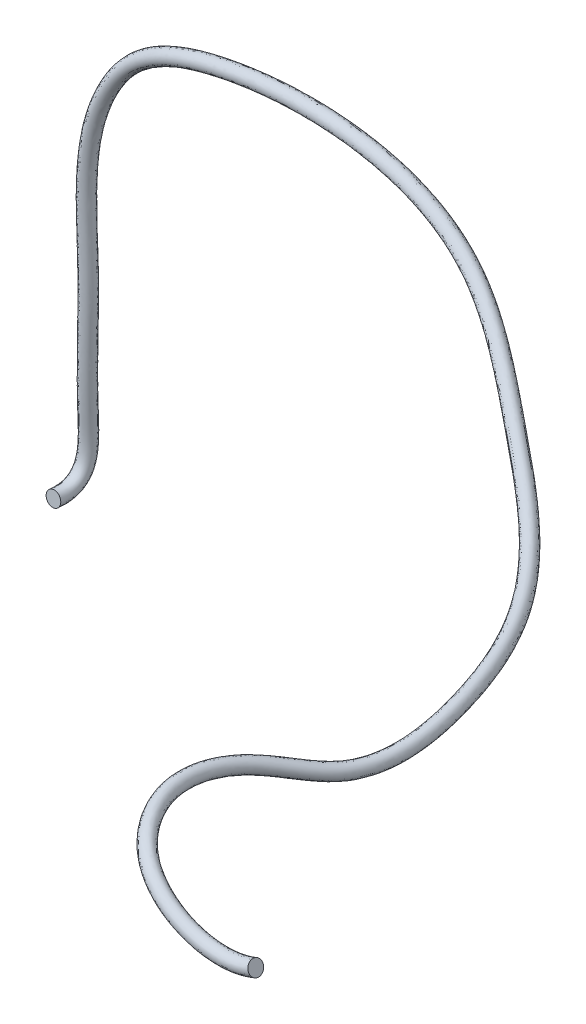
ISO-10303-21;
HEADER;
FILE_DESCRIPTION(('STEP AP214'),'2;1');
FILE_NAME('part.step','',(''),(''),'','','');
FILE_SCHEMA(('AUTOMOTIVE_DESIGN { 1 0 10303 214 1 1 1 1 }'));
ENDSEC;
DATA;
#1=APPLICATION_CONTEXT('core data for automotive mechanical design processes');
#2=APPLICATION_PROTOCOL_DEFINITION('international standard','automotive_design',2000,#1);
#3=PRODUCT_CONTEXT('',#1,'mechanical');
#4=PRODUCT('Part','Part','',(#3));
#5=PRODUCT_RELATED_PRODUCT_CATEGORY('part','',(#4));
#6=PRODUCT_DEFINITION_FORMATION('','',#4);
#7=PRODUCT_DEFINITION_CONTEXT('part definition',#1,'design');
#8=PRODUCT_DEFINITION('design','',#6,#7);
#9=PRODUCT_DEFINITION_SHAPE('','',#8);
#10=(LENGTH_UNIT() NAMED_UNIT(*) SI_UNIT(.MILLI.,.METRE.));
#11=(NAMED_UNIT(*) PLANE_ANGLE_UNIT() SI_UNIT($,.RADIAN.));
#12=(NAMED_UNIT(*) SI_UNIT($,.STERADIAN.) SOLID_ANGLE_UNIT());
#13=UNCERTAINTY_MEASURE_WITH_UNIT(LENGTH_MEASURE(1.E-05),#10,'distance_accuracy_value','');
#14=(GEOMETRIC_REPRESENTATION_CONTEXT(3) GLOBAL_UNCERTAINTY_ASSIGNED_CONTEXT((#13)) GLOBAL_UNIT_ASSIGNED_CONTEXT((#10,
#11,#12)) REPRESENTATION_CONTEXT('',''));
#15=CARTESIAN_POINT('',(0.,0.,0.));
#16=DIRECTION('',(0.,0.,1.));
#17=DIRECTION('',(1.,0.,0.));
#18=AXIS2_PLACEMENT_3D('',#15,#16,#17);
#19=CARTESIAN_POINT('',(350.5,-44.55,26.));
#20=DIRECTION('',(-0.920430164121423,-0.390678030883505,-0.0133786830591489));
#21=DIRECTION('',(0.390712999144147,-0.920512548692187,0.));
#22=AXIS2_PLACEMENT_3D('',#19,#20,#21);
#23=PLANE('',#22);
#24=CARTESIAN_POINT('',(350.5,-44.55,26.));
#25=DIRECTION('',(-0.920430164121423,-0.390678030883505,-0.0133786830591489));
#26=DIRECTION('',(0.390712999144147,-0.920512548692187,0.));
#27=AXIS2_PLACEMENT_3D('',#24,#25,#26);
#28=CIRCLE('',#27,2.);
#29=CARTESIAN_POINT('',(351.281425998288,-46.3910250973844,26.));
#30=VERTEX_POINT('',#29);
#31=EDGE_CURVE('E49',#30,#30,#28,.T.);
#32=ORIENTED_EDGE('',*,*,#31,.F.);
#33=EDGE_LOOP('',(#32));
#34=FACE_BOUND('',#33,.T.);
#35=ADVANCED_FACE('F43',(#34),#23,.F.);
#36=CARTESIAN_POINT('',(90.4,-165.2,-178.5));
#37=DIRECTION('',(-0.00194940277841438,0.105661396806183,0.994400255960232));
#38=DIRECTION('',(0.923946253389505,0.380567105209496,-0.0386264065110958));
#39=AXIS2_PLACEMENT_3D('',#36,#37,#38);
#40=PLANE('',#39);
#41=CARTESIAN_POINT('',(90.4,-165.2,-178.5));
#42=DIRECTION('',(-0.00194940277841438,0.105661396806183,0.994400255960232));
#43=DIRECTION('',(0.923946253389505,0.380567105209496,-0.0386264065110958));
#44=AXIS2_PLACEMENT_3D('',#41,#42,#43);
#45=CIRCLE('',#44,2.);
#46=CARTESIAN_POINT('',(92.247892506779,-164.438865789581,-178.577252813022));
#47=VERTEX_POINT('',#46);
#48=EDGE_CURVE('E11',#47,#47,#45,.T.);
#49=ORIENTED_EDGE('',*,*,#48,.T.);
#50=EDGE_LOOP('',(#49));
#51=FACE_BOUND('',#50,.T.);
#52=ADVANCED_FACE('F58',(#51),#40,.T.);
#53=CARTESIAN_POINT('',(351.281425998288,-46.3910250973844,26.));
#54=CARTESIAN_POINT('',(348.006936387062,-47.7808873608247,25.952404474327));
#55=CARTESIAN_POINT('',(344.634188663848,-48.2863943749706,26.0577063917715));
#56=CARTESIAN_POINT('',(338.024706827411,-48.1260286045921,26.1884017401017));
#57=CARTESIAN_POINT('',(334.781119931245,-47.4696623067302,26.2133122468411));
#58=CARTESIAN_POINT('',(328.565933601113,-45.6114282594286,25.8303921643623));
#59=CARTESIAN_POINT('',(325.59144162882,-44.407736090693,25.4227421385242));
#60=CARTESIAN_POINT('',(320.058487227376,-41.9993497463568,23.8497355668093));
#61=CARTESIAN_POINT('',(317.502657124092,-40.795666727754,22.6847520430027));
#62=CARTESIAN_POINT('',(312.777764645112,-38.8209335544422,19.1713945646285));
#63=CARTESIAN_POINT('',(310.600294162835,-38.0673850006267,16.6949157074232));
#64=CARTESIAN_POINT('',(307.146010796822,-37.0872707729324,11.0138901049808));
#65=CARTESIAN_POINT('',(305.869977510349,-36.860560687398,7.80905431033951));
#66=CARTESIAN_POINT('',(304.557474381633,-36.9092902077417,1.26783090439298));
#67=CARTESIAN_POINT('',(304.505858644009,-37.1839950582266,-2.06373389031865));
#68=CARTESIAN_POINT('',(305.307147865088,-38.1882852029584,-8.56521970797688));
#69=CARTESIAN_POINT('',(306.160282395386,-38.9180364375727,-11.7353321120626));
#70=CARTESIAN_POINT('',(308.857327942076,-41.1000507215743,-18.622085507215));
#71=CARTESIAN_POINT('',(310.971330478008,-42.7395095793845,-22.2300762218425));
#72=CARTESIAN_POINT('',(313.787123518815,-44.803908570956,-27.8787665248462));
#73=CARTESIAN_POINT('',(314.666076236427,-45.4258199358012,-29.8029603576391));
#74=CARTESIAN_POINT('',(316.087715607426,-46.361490387502,-33.8619837959787));
#75=CARTESIAN_POINT('',(316.622360295198,-46.6702498562466,-35.9720713330296));
#76=CARTESIAN_POINT('',(317.760959484153,-47.2400130794986,-42.4580786313488));
#77=CARTESIAN_POINT('',(317.901163025068,-47.1462107378986,-46.9896061315749));
#78=CARTESIAN_POINT('',(317.271230555564,-46.6307451799339,-56.072602471142));
#79=CARTESIAN_POINT('',(316.499898724184,-46.2083986552867,-60.6258786597293));
#80=CARTESIAN_POINT('',(312.54884271341,-45.1320434643854,-76.6866113682913));
#81=CARTESIAN_POINT('',(307.420013071522,-45.2578207852271,-87.3298903953066));
#82=CARTESIAN_POINT('',(295.427102410934,-44.6789759850232,-103.693326923246));
#83=CARTESIAN_POINT('',(289.382916524968,-44.1796645332348,-109.934352130965));
#84=CARTESIAN_POINT('',(276.407213439062,-43.0548329475503,-121.677676525752));
#85=CARTESIAN_POINT('',(269.475698065578,-42.429311560214,-127.179907894902));
#86=CARTESIAN_POINT('',(248.680506862676,-40.9212497021526,-143.768135155318));
#87=CARTESIAN_POINT('',(235.003814118442,-40.4324736521067,-154.783721128352));
#88=CARTESIAN_POINT('',(205.595932328395,-41.4000932651125,-171.693552308711));
#89=CARTESIAN_POINT('',(189.995893652096,-42.7320852297441,-177.920746420813));
#90=CARTESIAN_POINT('',(158.95455638572,-45.0378361419355,-184.751251019713));
#91=CARTESIAN_POINT('',(143.683707747999,-46.0246679753455,-185.636857172301));
#92=CARTESIAN_POINT('',(123.90269200689,-50.9962492061744,-186.624872752748));
#93=CARTESIAN_POINT('',(119.40485189612,-52.3807518648059,-186.8379024045));
#94=CARTESIAN_POINT('',(111.15046764701,-56.0807845626403,-187.178911834504));
#95=CARTESIAN_POINT('',(107.400435487813,-58.3920430921229,-187.306682136797));
#96=CARTESIAN_POINT('',(101.088648289307,-64.4781475615732,-187.428440642805));
#97=CARTESIAN_POINT('',(98.4933701341109,-68.4018143894985,-187.417906008281));
#98=CARTESIAN_POINT('',(95.5788616279908,-74.866203709602,-187.387312582731));
#99=CARTESIAN_POINT('',(94.7703879631235,-77.1160705098192,-187.374747954712));
#100=CARTESIAN_POINT('',(93.4815502455784,-81.6882184085731,-187.361351953589));
#101=CARTESIAN_POINT('',(93.004547914805,-84.0073042242209,-187.361870669363));
#102=CARTESIAN_POINT('',(91.2743151136328,-95.7277052901096,-187.385551178399));
#103=CARTESIAN_POINT('',(92.00055484455,-105.501830536037,-187.470252773701));
#104=CARTESIAN_POINT('',(92.6413254734323,-126.018070991818,-187.239860114289));
#105=CARTESIAN_POINT('',(92.3535447399365,-136.376669332737,-186.853366071505));
#106=CARTESIAN_POINT('',(92.2933483387177,-149.54523381935,-187.384031672011));
#107=CARTESIAN_POINT('',(92.2913905496273,-150.05889673796,-187.406036470419));
#108=CARTESIAN_POINT('',(92.2881385474783,-151.086254107535,-187.447217877935));
#109=CARTESIAN_POINT('',(92.2882925517764,-151.599854071564,-187.470640032718));
#110=CARTESIAN_POINT('',(92.2799338632248,-152.622156399383,-187.48187200871));
#111=CARTESIAN_POINT('',(92.2703129520621,-153.130658247073,-187.467290352512));
#112=CARTESIAN_POINT('',(92.2600720610183,-154.134831331784,-187.449573444021));
#113=CARTESIAN_POINT('',(92.256842557237,-154.630794597357,-187.438545724591));
#114=CARTESIAN_POINT('',(92.244689583781,-157.0657568803,-187.343235974629));
#115=CARTESIAN_POINT('',(92.2462455497998,-158.869822993211,-187.129147565897));
#116=CARTESIAN_POINT('',(92.2486012988609,-161.067267396449,-186.359478328191));
#117=CARTESIAN_POINT('',(92.2497337386584,-161.714243652484,-186.031320397658));
#118=CARTESIAN_POINT('',(92.2517667592062,-162.815380795443,-185.204815054665));
#119=CARTESIAN_POINT('',(92.2526819209484,-163.271758672791,-184.708168634248));
#120=CARTESIAN_POINT('',(92.2536635282223,-163.99447719288,-183.473609327561));
#121=CARTESIAN_POINT('',(92.2537358355611,-164.261558749752,-182.732034013553));
#122=CARTESIAN_POINT('',(92.2522497032186,-164.552273553495,-180.915156396149));
#123=CARTESIAN_POINT('',(92.2506829460298,-164.573858837143,-179.840525846529));
#124=CARTESIAN_POINT('',(92.247892506779,-164.438865789581,-178.577252813022));
#125=CARTESIAN_POINT('',(351.232165015725,-46.4119339989149,29.9996420056592));
#126=CARTESIAN_POINT('',(348.060814165556,-47.758018853543,29.9535456276123));
#127=CARTESIAN_POINT('',(344.742255319498,-48.2695066356563,30.0563122609008));
#128=CARTESIAN_POINT('',(338.075787664065,-48.1079922572493,30.1881364728639));
#129=CARTESIAN_POINT('',(334.729066563874,-47.4410514461608,30.2168234139268));
#130=CARTESIAN_POINT('',(328.173592644992,-45.4814041790101,29.8129531632883));
#131=CARTESIAN_POINT('',(324.961259795667,-44.1871927867259,29.3825199758323));
#132=CARTESIAN_POINT('',(318.799253157666,-41.5053725203398,27.6307308148099));
#133=CARTESIAN_POINT('',(315.841576817054,-40.1122952860185,26.3033516119472));
#134=CARTESIAN_POINT('',(310.220742841121,-37.7631102955793,22.1237858609963));
#135=CARTESIAN_POINT('',(307.707694033219,-36.8964829608941,19.246652910201));
#136=CARTESIAN_POINT('',(303.739933767997,-35.7706709114755,12.7211434334566));
#137=CARTESIAN_POINT('',(302.277889089147,-35.5105238435652,9.05314674788157));
#138=CARTESIAN_POINT('',(300.759613088912,-35.5669450651169,1.48651748799536));
#139=CARTESIAN_POINT('',(300.709272098762,-35.8843968276138,-2.31614503138659));
#140=CARTESIAN_POINT('',(301.609269792892,-37.0125256246519,-9.61879624514458));
#141=CARTESIAN_POINT('',(302.557780031099,-37.8225106140561,-13.1246443718887));
#142=CARTESIAN_POINT('',(305.5239529358,-40.2222593928526,-20.6985992969391));
#143=CARTESIAN_POINT('',(307.709126551608,-41.9120356327299,-24.4017246379105));
#144=CARTESIAN_POINT('',(310.393438264817,-43.8799765129833,-29.7866281695014));
#145=CARTESIAN_POINT('',(311.191565652013,-44.4435423023448,-31.5463706391018));
#146=CARTESIAN_POINT('',(312.434448370146,-45.2615542370712,-35.0950091484165));
#147=CARTESIAN_POINT('',(312.908354108316,-45.5356550984502,-36.9577611658981));
#148=CARTESIAN_POINT('',(313.928301749751,-46.0459645979645,-42.7677713648008));
#149=CARTESIAN_POINT('',(314.068977856795,-45.9665912749611,-46.9401402841867));
#150=CARTESIAN_POINT('',(313.478021385803,-45.4830175848235,-55.4611470971445));
#151=CARTESIAN_POINT('',(312.746969756459,-45.0805735013208,-59.8052899279427));
#152=CARTESIAN_POINT('',(308.947524844283,-44.0455204237119,-75.249735529528));
#153=CARTESIAN_POINT('',(304.03327782069,-44.1674511184692,-85.433889021132));
#154=CARTESIAN_POINT('',(292.55868586832,-43.6136233216372,-101.090118117708));
#155=CARTESIAN_POINT('',(286.712755742234,-43.1318533517397,-107.141133436153));
#156=CARTESIAN_POINT('',(273.992242381099,-42.0291426841131,-118.653505262808));
#157=CARTESIAN_POINT('',(267.121854732014,-41.4086008068762,-124.111061499695));
#158=CARTESIAN_POINT('',(246.289583257904,-39.8978498935791,-140.728867520975));
#159=CARTESIAN_POINT('',(232.736449754205,-39.4221343091084,-151.626221230445));
#160=CARTESIAN_POINT('',(203.936184808945,-40.3697612783577,-168.186666537935));
#161=CARTESIAN_POINT('',(188.670460798132,-41.6735249289066,-174.272494330779));
#162=CARTESIAN_POINT('',(158.447635212432,-43.9184767442872,-180.922889180579));
#163=CARTESIAN_POINT('',(143.321849186973,-44.8735694194362,-181.821480338857));
#164=CARTESIAN_POINT('',(123.397156359998,-49.8812611156232,-182.816672263623));
#165=CARTESIAN_POINT('',(118.845789336665,-51.27976432605,-183.032345489389));
#166=CARTESIAN_POINT('',(110.43895134715,-55.048134045117,-183.379653301029));
#167=CARTESIAN_POINT('',(106.586654391717,-57.4159119660565,-183.51118607443));
#168=CARTESIAN_POINT('',(100.062509892115,-63.7067807108128,-183.63704109896));
#169=CARTESIAN_POINT('',(97.3940042348533,-67.7460129888771,-183.626056222106));
#170=CARTESIAN_POINT('',(94.3995612074941,-74.3876662581587,-183.594628330058));
#171=CARTESIAN_POINT('',(93.5693538222973,-76.6979213130808,-183.581726308891));
#172=CARTESIAN_POINT('',(92.2447320725588,-81.3969519296547,-183.567964337117));
#173=CARTESIAN_POINT('',(91.7552930544854,-83.7783611750178,-183.56850640257));
#174=CARTESIAN_POINT('',(89.9873694824361,-95.754117483268,-183.592700704253));
#175=CARTESIAN_POINT('',(90.7313245857341,-105.591451524901,-183.676892261319));
#176=CARTESIAN_POINT('',(91.3658126864974,-125.906535840287,-183.448758521632));
#177=CARTESIAN_POINT('',(91.0795160765271,-136.347710910523,-183.057714662437));
#178=CARTESIAN_POINT('',(91.0184836856751,-149.699173715079,-183.595750655139));
#179=CARTESIAN_POINT('',(91.0165316604261,-150.213100079649,-183.617765505145));
#180=CARTESIAN_POINT('',(91.0133215664487,-151.227698417956,-183.658434968347));
#181=CARTESIAN_POINT('',(91.0220054426,-151.728355924419,-183.678438747069));
#182=CARTESIAN_POINT('',(90.9763130556629,-152.710421820164,-183.701188424736));
#183=CARTESIAN_POINT('',(90.9160633271577,-153.191776643884,-183.703760537323));
#184=CARTESIAN_POINT('',(90.8553196010503,-154.127686968676,-183.704109032328));
#185=CARTESIAN_POINT('',(90.8364261321525,-154.582297263972,-183.699195355659));
#186=CARTESIAN_POINT('',(90.7618242648889,-156.768125417312,-183.634416508052));
#187=CARTESIAN_POINT('',(90.7565886628946,-158.23457815601,-183.420679212368));
#188=CARTESIAN_POINT('',(90.7437144227709,-159.565726692805,-182.957342415657));
#189=CARTESIAN_POINT('',(90.7408655599992,-159.860602278812,-182.792266633764));
#190=CARTESIAN_POINT('',(90.7358645710016,-160.239301662477,-182.50852211758));
#191=CARTESIAN_POINT('',(90.7338007188658,-160.336242774646,-182.399826409837));
#192=CARTESIAN_POINT('',(90.7300557138421,-160.551225636285,-182.033006854718));
#193=CARTESIAN_POINT('',(90.7284096459261,-160.673651054696,-181.753192045896));
#194=CARTESIAN_POINT('',(90.7242147335045,-160.839425358897,-180.720989808743));
#195=CARTESIAN_POINT('',(90.7216167905004,-160.870660788164,-179.972565539348));
#196=CARTESIAN_POINT('',(90.7178231191953,-160.764077419822,-178.970722134139));
#197=CARTESIAN_POINT('',(349.669313019148,-42.7298838041462,29.9996420056592));
#198=CARTESIAN_POINT('',(347.081785637513,-43.8281638695625,29.9620316479664));
#199=CARTESIAN_POINT('',(344.370526594587,-44.2593576982515,30.0460817633041));
#200=CARTESIAN_POINT('',(338.640794784203,-44.1205702746312,30.1596004753577));
#201=CARTESIAN_POINT('',(335.637215290788,-43.5376373913469,30.1896642870781));
#202=CARTESIAN_POINT('',(329.558456372611,-41.7205187575041,29.8154663850465));
#203=CARTESIAN_POINT('',(326.485481989064,-40.4884768970512,29.4129675570858));
#204=CARTESIAN_POINT('',(320.444783153004,-37.8594641808091,27.6960224302204));
#205=CARTESIAN_POINT('',(317.463791492809,-36.4550026401909,26.3748068650272));
#206=CARTESIAN_POINT('',(311.666176387373,-34.031933310456,22.0637895792831));
#207=CARTESIAN_POINT('',(309.101226454755,-33.148753903451,19.1186754405903));
#208=CARTESIAN_POINT('',(305.070235742965,-32.0050013091483,12.4891670730031));
#209=CARTESIAN_POINT('',(303.597538604124,-31.7437912740744,8.78682483861884));
#210=CARTESIAN_POINT('',(302.06897602182,-31.8005729318557,1.16920673346907));
#211=CARTESIAN_POINT('',(302.015320453275,-32.1203602783252,-2.67636673802001));
#212=CARTESIAN_POINT('',(302.929527328366,-33.2663745651652,-10.0949951583024));
#213=CARTESIAN_POINT('',(303.895102189325,-34.0915775812396,-13.673526784825));
#214=CARTESIAN_POINT('',(306.941218003354,-36.5560032847194,-21.4516115013407));
#215=CARTESIAN_POINT('',(309.136782755933,-38.2519832262131,-25.1626408906896));
#216=CARTESIAN_POINT('',(311.748120804751,-40.1664027744491,-30.4010385816102));
#217=CARTESIAN_POINT('',(312.508037208181,-40.7024911944629,-32.0818685596693));
#218=CARTESIAN_POINT('',(313.670971360108,-41.4678818388908,-35.4022214595565));
#219=CARTESIAN_POINT('',(314.120953185774,-41.7285547632926,-37.1638373986565));
#220=CARTESIAN_POINT('',(315.098112922915,-42.2174399623677,-42.729711808153));
#221=CARTESIAN_POINT('',(315.245741037185,-42.1455116018792,-46.8186273658283));
#222=CARTESIAN_POINT('',(314.656674316503,-41.6634835731362,-55.3124055729107));
#223=CARTESIAN_POINT('',(313.922952068098,-41.2565067998379,-59.7091584662327));
#224=CARTESIAN_POINT('',(310.013653301765,-40.1915271015141,-75.6001517934689));
#225=CARTESIAN_POINT('',(304.984849254148,-40.3174690236578,-85.9564969451931));
#226=CARTESIAN_POINT('',(293.478218366034,-39.762094837639,-101.656440708816));
#227=CARTESIAN_POINT('',(287.614421506967,-39.2788815616094,-107.726284142108));
#228=CARTESIAN_POINT('',(274.852207156796,-38.172556114448,-119.276397493147));
#229=CARTESIAN_POINT('',(267.957981593427,-37.5498452677464,-124.753002771875));
#230=CARTESIAN_POINT('',(247.044298316856,-36.0331903933863,-141.435750613966));
#231=CARTESIAN_POINT('',(233.366624182886,-35.5490988036939,-152.441730792135));
#232=CARTESIAN_POINT('',(204.147247128645,-36.5105159839832,-169.243169799558));
#233=CARTESIAN_POINT('',(188.731579154242,-37.8284642386707,-175.377905860743));
#234=CARTESIAN_POINT('',(158.317981958052,-40.0875865830197,-182.070279173637));
#235=CARTESIAN_POINT('',(142.888534746691,-41.0495368418473,-183.002679802323));
#236=CARTESIAN_POINT('',(122.393131714884,-46.2006656792058,-184.026377401235));
#237=CARTESIAN_POINT('',(117.630957263785,-47.6544132435202,-184.252457309349));
#238=CARTESIAN_POINT('',(108.625720442338,-51.6910157532734,-184.624486924496));
#239=CARTESIAN_POINT('',(104.372808120456,-54.2803251267238,-184.770753771884));
#240=CARTESIAN_POINT('',(97.0175783884494,-61.3725630328064,-184.912640997595));
#241=CARTESIAN_POINT('',(94.099957700707,-65.8251632477768,-184.899538696813));
#242=CARTESIAN_POINT('',(90.8572509377706,-73.0174772043249,-184.865518131282));
#243=CARTESIAN_POINT('',(89.9652683434418,-75.5025429275037,-184.851652276325));
#244=CARTESIAN_POINT('',(88.544999185449,-80.5409037152771,-184.836913353212));
#245=CARTESIAN_POINT('',(88.0235448934096,-83.0831453609667,-184.837519798993));
#246=CARTESIAN_POINT('',(86.1532216423836,-95.7525308984986,-184.863109173023));
#247=CARTESIAN_POINT('',(86.9442100132786,-105.825043347282,-184.947088070587));
#248=CARTESIAN_POINT('',(87.5718408048417,-125.920570407075,-184.721419855954));
#249=CARTESIAN_POINT('',(87.2881211323201,-136.285041710423,-184.331069521135));
#250=CARTESIAN_POINT('',(87.2271170866021,-149.630297888091,-184.868855320925));
#251=CARTESIAN_POINT('',(87.2251557675049,-150.146097033284,-184.890948578524));
#252=CARTESIAN_POINT('',(87.2219200905573,-151.168615676286,-184.931934000979));
#253=CARTESIAN_POINT('',(87.2276912430259,-151.6755096849,-184.943684244466));
#254=CARTESIAN_POINT('',(87.1946570174352,-152.673105795337,-185.004317067146));
#255=CARTESIAN_POINT('',(87.1521946107256,-153.164155368527,-185.057808819691));
#256=CARTESIAN_POINT('',(87.1100039378441,-154.127402626085,-185.10893211867));
#257=CARTESIAN_POINT('',(87.0970952482163,-154.599071052392,-185.119658545326));
#258=CARTESIAN_POINT('',(87.0464540113777,-156.8881739882,-185.114650308416));
#259=CARTESIAN_POINT('',(87.0443128637441,-158.495537350582,-184.908339694501));
#260=CARTESIAN_POINT('',(87.0376034335792,-160.184248103219,-184.334923212054));
#261=CARTESIAN_POINT('',(87.0363762486904,-160.624135986466,-184.10664175522));
#262=CARTESIAN_POINT('',(87.0342450376957,-161.300313231355,-183.606736127246));
#263=CARTESIAN_POINT('',(87.0334001238497,-161.545285941964,-183.341683014252));
#264=CARTESIAN_POINT('',(87.0315935935456,-161.970422619637,-182.623855124167));
#265=CARTESIAN_POINT('',(87.030655338471,-162.153488441393,-182.156714255301));
#266=CARTESIAN_POINT('',(87.0275811730797,-162.373649947602,-180.80578969364));
#267=CARTESIAN_POINT('',(87.0254127989848,-162.402728108706,-179.924625659352));
#268=CARTESIAN_POINT('',(87.0220381056373,-162.28634584066,-178.816216508095));
#269=CARTESIAN_POINT('',(349.718574001712,-42.7089749026156,26.));
#270=CARTESIAN_POINT('',(347.027907858929,-43.8510323768386,25.9608904946811));
#271=CARTESIAN_POINT('',(344.262459939023,-44.2762454375658,26.0474758941723));
#272=CARTESIAN_POINT('',(338.589713947464,-44.138606621974,26.1598657425982));
#273=CARTESIAN_POINT('',(335.689268658203,-43.5662482519162,26.1861531199871));
#274=CARTESIAN_POINT('',(329.950797328688,-41.8505428379225,25.8329053861259));
#275=CARTESIAN_POINT('',(327.115663822174,-40.7090202010611,25.453189719767));
#276=CARTESIAN_POINT('',(321.704017222756,-38.3534414067832,23.9150271822305));
#277=CARTESIAN_POINT('',(319.124871799805,-37.1383740819265,22.7562072960617));
#278=CARTESIAN_POINT('',(314.22319819141,-35.089756569319,19.111398282938));
#279=CARTESIAN_POINT('',(311.993826584371,-34.3196559431836,16.5669382378125));
#280=CARTESIAN_POINT('',(308.47631277179,-33.3216011706051,10.7819137445273));
#281=CARTESIAN_POINT('',(307.189627025419,-33.0938281179536,7.5427324011233));
#282=CARTESIAN_POINT('',(305.866837314448,-33.142918074434,0.950520149820274));
#283=CARTESIAN_POINT('',(305.81190699843,-33.4199585089959,-2.42395559681288));
#284=CARTESIAN_POINT('',(306.627405400656,-34.4421341434138,-9.04141862127392));
#285=CARTESIAN_POINT('',(307.497604553612,-35.1871034047678,-12.2842145250453));
#286=CARTESIAN_POINT('',(310.27459300963,-37.4337946134255,-19.3750977115544));
#287=CARTESIAN_POINT('',(312.398986682333,-39.079457172845,-22.9909924746822));
#288=CARTESIAN_POINT('',(315.141806058748,-41.0903348324332,-28.4931769369247));
#289=CARTESIAN_POINT('',(315.982547792625,-41.6847688279194,-30.3384582781769));
#290=CARTESIAN_POINT('',(317.324238597358,-42.5678179893216,-34.1691961071485));
#291=CARTESIAN_POINT('',(317.834959372685,-42.8631495211041,-36.178147565728));
#292=CARTESIAN_POINT('',(318.930770657256,-43.4114884438718,-42.4200190748209));
#293=CARTESIAN_POINT('',(319.07792620552,-43.3251310647851,-46.8680932132166));
#294=CARTESIAN_POINT('',(318.449883486201,-42.8112111682782,-55.9238609469082));
#295=CARTESIAN_POINT('',(317.675881035823,-42.3843319538355,-60.5297471980825));
#296=CARTESIAN_POINT('',(313.614971170892,-41.2780501421027,-77.0370276320622));
#297=CARTESIAN_POINT('',(308.37158450498,-41.4078386906585,-87.8524983193677));
#298=CARTESIAN_POINT('',(296.346634908647,-40.8274475008449,-104.259649514353));
#299=CARTESIAN_POINT('',(290.284582290067,-40.3266927432873,-110.519502836737));
#300=CARTESIAN_POINT('',(277.267178214393,-39.1982463777023,-122.300568756275));
#301=CARTESIAN_POINT('',(270.311824927113,-38.5705560212068,-127.821849167205));
#302=CARTESIAN_POINT('',(249.43522192138,-37.0565902017119,-144.475018248062));
#303=CARTESIAN_POINT('',(235.633988546878,-36.5594381465696,-155.599230690165));
#304=CARTESIAN_POINT('',(205.806994648323,-37.5408479708525,-172.750055570219));
#305=CARTESIAN_POINT('',(190.057012008663,-38.887024539394,-179.026157950663));
#306=CARTESIAN_POINT('',(158.82490313091,-41.2069459807755,-185.898641012879));
#307=CARTESIAN_POINT('',(143.250393307939,-42.2006353977012,-186.818056635767));
#308=CARTESIAN_POINT('',(122.898667361711,-47.3156537697735,-187.83457789036));
#309=CARTESIAN_POINT('',(118.190019823175,-48.7554007822761,-188.058014224525));
#310=CARTESIAN_POINT('',(109.337236742264,-52.7236662707967,-188.423745457906));
#311=CARTESIAN_POINT('',(105.186589216552,-55.2564562528061,-188.566249834252));
#312=CARTESIAN_POINT('',(98.0437167856418,-62.1439298835502,-188.704040541439));
#313=CARTESIAN_POINT('',(95.199323600033,-66.480964648364,-188.691388483023));
#314=CARTESIAN_POINT('',(92.0365513582332,-73.4960146557853,-188.658202383938));
#315=CARTESIAN_POINT('',(91.166302484285,-75.920692124225,-188.644673922129));
#316=CARTESIAN_POINT('',(89.7818173584515,-80.8321701942127,-188.630300969701));
#317=CARTESIAN_POINT('',(89.2727997537462,-83.3120884101359,-188.630884065769));
#318=CARTESIAN_POINT('',(87.4401672735125,-95.7261187054756,-188.655959647237));
#319=CARTESIAN_POINT('',(88.2134402719643,-105.735422358288,-188.740448582969));
#320=CARTESIAN_POINT('',(88.8473535919297,-126.03210555876,-188.512521448611));
#321=CARTESIAN_POINT('',(88.5621497957295,-136.314000132636,-188.12672093029));
#322=CARTESIAN_POINT('',(88.5019817396447,-149.476357992362,-188.657136337794));
#323=CARTESIAN_POINT('',(88.5000146567061,-149.991893691603,-188.679219543799));
#324=CARTESIAN_POINT('',(88.4967370715869,-151.027171365859,-188.720716910567));
#325=CARTESIAN_POINT('',(88.4939783522022,-151.547007832052,-188.735885530115));
#326=CARTESIAN_POINT('',(88.4982778249971,-152.584840374548,-188.78500065112));
#327=CARTESIAN_POINT('',(88.5064442356265,-153.103036971717,-188.821338634873));
#328=CARTESIAN_POINT('',(88.5147563978157,-154.134546989193,-188.854396530371));
#329=CARTESIAN_POINT('',(88.5175116732974,-154.647568385784,-188.859008914254));
#330=CARTESIAN_POINT('',(88.5293193302836,-157.185805451161,-188.823469775007));
#331=CARTESIAN_POINT('',(88.5339697506494,-159.130782187807,-188.616808048029));
#332=CARTESIAN_POINT('',(88.5424903096691,-161.685788806852,-187.737059124589));
#333=CARTESIAN_POINT('',(88.5452444273604,-162.477777360127,-187.345695519097));
#334=CARTESIAN_POINT('',(88.5501472258894,-163.876392364332,-186.303029064347));
#335=CARTESIAN_POINT('',(88.5522813259323,-164.480801840098,-185.650025238657));
#336=CARTESIAN_POINT('',(88.5552014079258,-165.413674176242,-184.064457597016));
#337=CARTESIAN_POINT('',(88.5559815281131,-165.741396136463,-183.135556222957));
#338=CARTESIAN_POINT('',(88.555616142787,-166.086498142187,-180.999956281046));
#339=CARTESIAN_POINT('',(88.5544789545234,-166.105926157703,-179.792585966533));
#340=CARTESIAN_POINT('',(88.552107493221,-165.961134210419,-178.422747186978));
#341=CARTESIAN_POINT('',(349.767834984275,-42.6880660010851,22.0003579943408));
#342=CARTESIAN_POINT('',(346.974030080345,-43.8739008841147,21.9597493413959));
#343=CARTESIAN_POINT('',(344.154393283459,-44.2931331768801,22.0488700250404));
#344=CARTESIAN_POINT('',(338.538633110725,-44.1566429693168,22.1601310098387));
#345=CARTESIAN_POINT('',(335.741322025618,-43.5948591124856,22.182641952896));
#346=CARTESIAN_POINT('',(330.343138284765,-41.980566918341,21.8503443872053));
#347=CARTESIAN_POINT('',(327.745845655285,-40.9295635050709,21.4934118824481));
#348=CARTESIAN_POINT('',(322.963251292509,-38.8474186327573,20.1340319342406));
#349=CARTESIAN_POINT('',(320.7859521068,-37.8217455236621,19.1376077270962));
#350=CARTESIAN_POINT('',(316.780219995447,-36.1475798281819,16.159006986593));
#351=CARTESIAN_POINT('',(314.886426713987,-35.4905579829161,14.0152010350347));
#352=CARTESIAN_POINT('',(311.882389800615,-34.638201032062,9.07466041605143));
#353=CARTESIAN_POINT('',(310.781715446713,-34.4438649618329,6.29863996362772));
#354=CARTESIAN_POINT('',(309.664698607075,-34.4852632170123,0.731833566171415));
#355=CARTESIAN_POINT('',(309.608493543585,-34.7195567396666,-2.1715444556058));
#356=CARTESIAN_POINT('',(310.325283472945,-35.6178937216624,-7.98784208424547));
#357=CARTESIAN_POINT('',(311.100106917898,-36.282629228296,-10.8949022652657));
#358=CARTESIAN_POINT('',(313.607968015906,-38.3115859421317,-17.2985839217682));
#359=CARTESIAN_POINT('',(315.661190608733,-39.9069311194769,-20.8193440586749));
#360=CARTESIAN_POINT('',(318.535491312746,-42.0142668904172,-26.5853152922392));
#361=CARTESIAN_POINT('',(319.457058377069,-42.6670464613758,-28.5950479966843));
#362=CARTESIAN_POINT('',(320.977505834609,-43.6677541397524,-32.9361707547403));
#363=CARTESIAN_POINT('',(321.548965559597,-43.9977442789155,-35.1924577327995));
#364=CARTESIAN_POINT('',(322.763428391598,-44.605536925376,-42.1103263414889));
#365=CARTESIAN_POINT('',(322.910111373855,-44.5047505276911,-46.917559060605));
#366=CARTESIAN_POINT('',(322.243092655899,-43.9589387634203,-56.5353163209059));
#367=CARTESIAN_POINT('',(321.428810003548,-43.5121571078331,-61.3503359299325));
#368=CARTESIAN_POINT('',(317.21628904002,-42.3645731826914,-78.4739034706557));
#369=CARTESIAN_POINT('',(311.758319755811,-42.4982083576593,-89.7484996935423));
#370=CARTESIAN_POINT('',(299.21505145126,-41.8928001640508,-106.862858319891));
#371=CARTESIAN_POINT('',(292.954743073166,-41.3745039249652,-113.312721531366));
#372=CARTESIAN_POINT('',(279.68214927199,-40.2239366409567,-125.324740019403));
#373=CARTESIAN_POINT('',(272.6656682608,-39.5912667746672,-130.890695562535));
#374=CARTESIAN_POINT('',(251.826145525904,-38.0799900100375,-147.514285882157));
#375=CARTESIAN_POINT('',(237.90135291087,-37.5697774894452,-158.756730588195));
#376=CARTESIAN_POINT('',(207.466742168001,-38.5711799577219,-176.25694134088));
#377=CARTESIAN_POINT('',(191.382444863084,-39.9455848401174,-182.674410040583));
#378=CARTESIAN_POINT('',(159.331824303767,-42.3263053785315,-189.727002852121));
#379=CARTESIAN_POINT('',(143.612251869187,-43.3517339535551,-190.63343346921));
#380=CARTESIAN_POINT('',(123.404203008537,-48.4306418603412,-191.642778379485));
#381=CARTESIAN_POINT('',(118.749082382564,-49.856388321032,-191.863571139702));
#382=CARTESIAN_POINT('',(110.048753042189,-53.75631678832,-192.223003991316));
#383=CARTESIAN_POINT('',(106.000370312648,-56.2325873788884,-192.361745896619));
#384=CARTESIAN_POINT('',(99.0698551828343,-62.915296734294,-192.495440085284));
#385=CARTESIAN_POINT('',(96.298689499359,-67.1367660489511,-192.483238269232));
#386=CARTESIAN_POINT('',(93.2158517786957,-73.9745521072457,-192.450886636593));
#387=CARTESIAN_POINT('',(92.3673366251284,-76.3388413209463,-192.437695567934));
#388=CARTESIAN_POINT('',(91.018635531454,-81.1234366731482,-192.42368858619));
#389=CARTESIAN_POINT('',(90.5220546140828,-83.5410314593052,-192.424248332545));
#390=CARTESIAN_POINT('',(88.7271129046415,-95.6997065124527,-192.448810121451));
#391=CARTESIAN_POINT('',(89.4826705306499,-105.645801369294,-192.53380909535));
#392=CARTESIAN_POINT('',(90.1228663790177,-126.143640710445,-192.303623041269));
#393=CARTESIAN_POINT('',(89.8361784591389,-136.34295855485,-191.922372339445));
#394=CARTESIAN_POINT('',(89.7768463926873,-149.322418096633,-192.445417354663));
#395=CARTESIAN_POINT('',(89.7748735459072,-149.837690349921,-192.467490509073));
#396=CARTESIAN_POINT('',(89.7715540526165,-150.885727055431,-192.509499820154));
#397=CARTESIAN_POINT('',(89.7602654613786,-151.418505979203,-192.528086815764));
#398=CARTESIAN_POINT('',(89.8018986325591,-152.49657495376,-192.565684235094));
#399=CARTESIAN_POINT('',(89.8606938605274,-153.041918574907,-192.584868450055));
#400=CARTESIAN_POINT('',(89.9195088577872,-154.1416913523,-192.599860942071));
#401=CARTESIAN_POINT('',(89.9379280983784,-154.696065719176,-192.598359283182));
#402=CARTESIAN_POINT('',(90.0121846491896,-157.483436914121,-192.532289241598));
#403=CARTESIAN_POINT('',(90.0236266375546,-159.766027025032,-192.325276401558));
#404=CARTESIAN_POINT('',(90.0473771857591,-163.187329510484,-191.139195037124));
#405=CARTESIAN_POINT('',(90.0541126060305,-164.331418733789,-190.584749282974));
#406=CARTESIAN_POINT('',(90.0660494140831,-166.452471497308,-188.999322001448));
#407=CARTESIAN_POINT('',(90.0711625280149,-167.416317738231,-187.958367463063));
#408=CARTESIAN_POINT('',(90.078809222306,-168.856925732847,-185.505060069864));
#409=CARTESIAN_POINT('',(90.0813077177551,-169.329303831533,-184.114398190614));
#410=CARTESIAN_POINT('',(90.0836511124943,-169.799346336771,-181.194122868453));
#411=CARTESIAN_POINT('',(90.0835451100619,-169.809124206701,-179.660546273715));
#412=CARTESIAN_POINT('',(90.0821768808047,-169.635922580178,-178.029277865861));
#413=CARTESIAN_POINT('',(351.330686980852,-46.3701161958538,22.0003579943408));
#414=CARTESIAN_POINT('',(347.953058608568,-47.8037558681065,21.9512633210418));
#415=CARTESIAN_POINT('',(344.526122008199,-48.3032821142849,22.0591005226423));
#416=CARTESIAN_POINT('',(337.973625990757,-48.1440649519348,22.1886670073395));
#417=CARTESIAN_POINT('',(334.833173298616,-47.4982731672995,22.2098010797555));
#418=CARTESIAN_POINT('',(328.958274557233,-45.7414523398471,21.8478311654363));
#419=CARTESIAN_POINT('',(326.221623461973,-44.62827939466,21.4629643012161));
#420=CARTESIAN_POINT('',(321.317721297086,-42.4933269723737,20.0687403188088));
#421=CARTESIAN_POINT('',(319.16373743113,-41.4790381694897,19.0661524740583));
#422=CARTESIAN_POINT('',(315.334786449103,-39.8787568133052,16.2190032682606));
#423=CARTESIAN_POINT('',(313.492894292451,-39.2382870403593,14.1431785046454));
#424=CARTESIAN_POINT('',(310.552087825647,-38.4038706343892,9.30663677650484));
#425=CARTESIAN_POINT('',(309.462065931551,-38.2105975312308,6.56496187279745));
#426=CARTESIAN_POINT('',(308.355335674353,-38.2516353503665,1.0491443207906));
#427=CARTESIAN_POINT('',(308.302445189257,-38.4835932888393,-1.8113227492507));
#428=CARTESIAN_POINT('',(309.005025937285,-39.364044781265,-7.51164317080918));
#429=CARTESIAN_POINT('',(309.762784759673,-40.0135622610893,-10.3460198522365));
#430=CARTESIAN_POINT('',(312.190702948351,-41.9778420502959,-16.5455717174908));
#431=CARTESIAN_POINT('',(314.233534404407,-43.5669835260391,-20.0584278057745));
#432=CARTESIAN_POINT('',(317.180808772812,-45.7278406289286,-25.9709048801911));
#433=CARTESIAN_POINT('',(318.140586820842,-46.4080975692577,-28.0595500761762));
#434=CARTESIAN_POINT('',(319.740982844706,-47.4614265379328,-32.6289584435409));
#435=CARTESIAN_POINT('',(320.336366482079,-47.8048446140431,-34.9863815001611));
#436=CARTESIAN_POINT('',(321.593617218554,-48.4340615610328,-42.1483858978967));
#437=CARTESIAN_POINT('',(321.73334819334,-48.3258302008362,-47.0390719789632));
#438=CARTESIAN_POINT('',(321.064439725326,-47.7784727750444,-56.6840578451396));
#439=CARTESIAN_POINT('',(320.252827691908,-47.3362238092526,-61.4464673915159));
#440=CARTESIAN_POINT('',(316.150160582538,-46.218566505059,-78.1234872070546));
#441=CARTESIAN_POINT('',(310.806748322353,-46.3481904519849,-89.2258917694812));
#442=CARTESIAN_POINT('',(298.295518953547,-45.7443286484093,-106.296535728783));
#443=CARTESIAN_POINT('',(292.053077307702,-45.2274757147298,-112.727570825776));
#444=CARTESIAN_POINT('',(278.822184497024,-44.0805232109875,-124.701847788697));
#445=CARTESIAN_POINT('',(271.829541399142,-43.4500223135518,-130.248754290109));
#446=CARTESIAN_POINT('',(251.071430467448,-41.9446495107261,-146.807402789662));
#447=CARTESIAN_POINT('',(237.271178482679,-41.442812995105,-157.94122102626));
#448=CARTESIAN_POINT('',(207.255679847844,-42.4304252518674,-175.200438079486));
#449=CARTESIAN_POINT('',(191.32132650606,-43.7906455305817,-181.568998510847));
#450=CARTESIAN_POINT('',(159.461477559008,-46.1571955395837,-188.579612858847));
#451=CARTESIAN_POINT('',(144.045566309025,-47.1757665312548,-189.452234005745));
#452=CARTESIAN_POINT('',(124.408227653782,-52.1112372967256,-190.433073241873));
#453=CARTESIAN_POINT('',(119.963914455574,-53.4817394035618,-190.643459319612));
#454=CARTESIAN_POINT('',(111.861983946871,-57.1134350801635,-190.978170367979));
#455=CARTESIAN_POINT('',(108.214216583909,-59.3681742181894,-191.102178199165));
#456=CARTESIAN_POINT('',(102.1147866865,-65.2495144123335,-191.219840186649));
#457=CARTESIAN_POINT('',(99.5927360333686,-69.0576157901199,-191.209755794456));
#458=CARTESIAN_POINT('',(96.7581620484876,-75.3447411610453,-191.179996835403));
#459=CARTESIAN_POINT('',(95.9714221039497,-77.5342197065576,-191.167769600533));
#460=CARTESIAN_POINT('',(94.718368418598,-81.9794848874916,-191.154739570061));
#461=CARTESIAN_POINT('',(94.2538027751247,-84.2362472734241,-191.155234936156));
#462=CARTESIAN_POINT('',(92.5612607448294,-95.7012930969513,-191.178401652545));
#463=CARTESIAN_POINT('',(93.2697851033659,-105.412209547173,-191.263613286082));
#464=CARTESIAN_POINT('',(93.9168382603671,-126.12960614335,-191.030961706946));
#465=CARTESIAN_POINT('',(93.6275734033458,-136.40562775495,-190.649017480572));
#466=CARTESIAN_POINT('',(93.5682129917603,-149.391293923621,-191.172312688884));
#467=CARTESIAN_POINT('',(93.5662494388285,-149.904693396271,-191.194307435694));
#468=CARTESIAN_POINT('',(93.5629555285079,-150.944809797114,-191.236000787522));
#469=CARTESIAN_POINT('',(93.5545796609527,-151.471352218708,-191.262841318367));
#470=CARTESIAN_POINT('',(93.5835546707868,-152.533890978601,-191.262555592684));
#471=CARTESIAN_POINT('',(93.6245625769665,-153.069539850263,-191.230820167702));
#472=CARTESIAN_POINT('',(93.6648245209863,-154.141975694891,-191.195037855715));
#473=CARTESIAN_POINT('',(93.6772589823214,-154.679291930742,-191.177896093523));
#474=CARTESIAN_POINT('',(93.7275549026731,-157.363388343288,-191.052055441206));
#475=CARTESIAN_POINT('',(93.7359024367051,-159.505067830413,-190.837615919426));
#476=CARTESIAN_POINT('',(93.7534881749509,-162.568808100093,-189.761614240726));
#477=CARTESIAN_POINT('',(93.7586019173176,-163.567885026157,-189.270374161551));
#478=CARTESIAN_POINT('',(93.7676689474108,-165.391459928409,-187.90110799175));
#479=CARTESIAN_POINT('',(93.7715631230309,-166.207274570935,-187.016510858659));
#480=CARTESIAN_POINT('',(93.7772713426025,-167.437728749474,-184.914211800404));
#481=CARTESIAN_POINT('',(93.7790620251962,-167.849466444809,-183.71087598121));
#482=CARTESIAN_POINT('',(93.7802846729329,-168.265121748093,-181.109322983555));
#483=CARTESIAN_POINT('',(93.7797491015592,-168.277056886122,-179.708486153711));
#484=CARTESIAN_POINT('',(93.7779618943627,-168.11365415934,-178.183783491905));
#485=CARTESIAN_POINT('',(351.281425998288,-46.3910250973844,26.));
#486=CARTESIAN_POINT('',(348.006936387062,-47.7808873608247,25.952404474327));
#487=CARTESIAN_POINT('',(344.634188663848,-48.2863943749706,26.0577063917715));
#488=CARTESIAN_POINT('',(338.024706827411,-48.1260286045921,26.1884017401017));
#489=CARTESIAN_POINT('',(334.781119931245,-47.4696623067302,26.2133122468411));
#490=CARTESIAN_POINT('',(328.565933601113,-45.6114282594286,25.8303921643623));
#491=CARTESIAN_POINT('',(325.59144162882,-44.407736090693,25.4227421385242));
#492=CARTESIAN_POINT('',(320.058487227376,-41.9993497463568,23.8497355668093));
#493=CARTESIAN_POINT('',(317.502657124092,-40.795666727754,22.6847520430027));
#494=CARTESIAN_POINT('',(312.777764645112,-38.8209335544422,19.1713945646285));
#495=CARTESIAN_POINT('',(310.600294162835,-38.0673850006267,16.6949157074232));
#496=CARTESIAN_POINT('',(307.146010796822,-37.0872707729324,11.0138901049808));
#497=CARTESIAN_POINT('',(305.869977510349,-36.860560687398,7.80905431033951));
#498=CARTESIAN_POINT('',(304.557474381633,-36.9092902077417,1.26783090439298));
#499=CARTESIAN_POINT('',(304.505858644009,-37.1839950582266,-2.06373389031865));
#500=CARTESIAN_POINT('',(305.307147865088,-38.1882852029584,-8.56521970797688));
#501=CARTESIAN_POINT('',(306.160282395386,-38.9180364375727,-11.7353321120626));
#502=CARTESIAN_POINT('',(308.857327942076,-41.1000507215743,-18.622085507215));
#503=CARTESIAN_POINT('',(310.971330478008,-42.7395095793845,-22.2300762218425));
#504=CARTESIAN_POINT('',(313.787123518815,-44.803908570956,-27.8787665248462));
#505=CARTESIAN_POINT('',(314.666076236427,-45.4258199358012,-29.8029603576391));
#506=CARTESIAN_POINT('',(316.087715607426,-46.361490387502,-33.8619837959787));
#507=CARTESIAN_POINT('',(316.622360295198,-46.6702498562466,-35.9720713330296));
#508=CARTESIAN_POINT('',(317.760959484153,-47.2400130794986,-42.4580786313488));
#509=CARTESIAN_POINT('',(317.901163025068,-47.1462107378986,-46.9896061315749));
#510=CARTESIAN_POINT('',(317.271230555564,-46.6307451799339,-56.072602471142));
#511=CARTESIAN_POINT('',(316.499898724184,-46.2083986552867,-60.6258786597293));
#512=CARTESIAN_POINT('',(312.54884271341,-45.1320434643854,-76.6866113682913));
#513=CARTESIAN_POINT('',(307.420013071522,-45.2578207852271,-87.3298903953066));
#514=CARTESIAN_POINT('',(295.427102410934,-44.6789759850232,-103.693326923246));
#515=CARTESIAN_POINT('',(289.382916524968,-44.1796645332348,-109.934352130965));
#516=CARTESIAN_POINT('',(276.407213439062,-43.0548329475503,-121.677676525752));
#517=CARTESIAN_POINT('',(269.475698065578,-42.429311560214,-127.179907894902));
#518=CARTESIAN_POINT('',(248.680506862676,-40.9212497021526,-143.768135155318));
#519=CARTESIAN_POINT('',(235.003814118442,-40.4324736521067,-154.783721128352));
#520=CARTESIAN_POINT('',(205.595932328395,-41.4000932651125,-171.693552308711));
#521=CARTESIAN_POINT('',(189.995893652096,-42.7320852297441,-177.920746420813));
#522=CARTESIAN_POINT('',(158.95455638572,-45.0378361419355,-184.751251019713));
#523=CARTESIAN_POINT('',(143.683707747999,-46.0246679753455,-185.636857172301));
#524=CARTESIAN_POINT('',(123.90269200689,-50.9962492061744,-186.624872752748));
#525=CARTESIAN_POINT('',(119.40485189612,-52.3807518648059,-186.8379024045));
#526=CARTESIAN_POINT('',(111.15046764701,-56.0807845626403,-187.178911834504));
#527=CARTESIAN_POINT('',(107.400435487813,-58.3920430921229,-187.306682136797));
#528=CARTESIAN_POINT('',(101.088648289307,-64.4781475615732,-187.428440642805));
#529=CARTESIAN_POINT('',(98.4933701341109,-68.4018143894985,-187.417906008281));
#530=CARTESIAN_POINT('',(95.5788616279908,-74.866203709602,-187.387312582731));
#531=CARTESIAN_POINT('',(94.7703879631235,-77.1160705098192,-187.374747954712));
#532=CARTESIAN_POINT('',(93.4815502455784,-81.6882184085731,-187.361351953589));
#533=CARTESIAN_POINT('',(93.004547914805,-84.0073042242209,-187.361870669363));
#534=CARTESIAN_POINT('',(91.2743151136328,-95.7277052901096,-187.385551178399));
#535=CARTESIAN_POINT('',(92.00055484455,-105.501830536037,-187.470252773701));
#536=CARTESIAN_POINT('',(92.6413254734323,-126.018070991818,-187.239860114289));
#537=CARTESIAN_POINT('',(92.3535447399365,-136.376669332737,-186.853366071505));
#538=CARTESIAN_POINT('',(92.2933483387177,-149.54523381935,-187.384031672011));
#539=CARTESIAN_POINT('',(92.2913905496273,-150.05889673796,-187.406036470419));
#540=CARTESIAN_POINT('',(92.2881385474783,-151.086254107535,-187.447217877935));
#541=CARTESIAN_POINT('',(92.2882925517764,-151.599854071564,-187.470640032718));
#542=CARTESIAN_POINT('',(92.2799338632248,-152.622156399383,-187.48187200871));
#543=CARTESIAN_POINT('',(92.2703129520621,-153.130658247073,-187.467290352512));
#544=CARTESIAN_POINT('',(92.2600720610183,-154.134831331784,-187.449573444021));
#545=CARTESIAN_POINT('',(92.256842557237,-154.630794597357,-187.438545724591));
#546=CARTESIAN_POINT('',(92.244689583781,-157.0657568803,-187.343235974629));
#547=CARTESIAN_POINT('',(92.2462455497998,-158.869822993211,-187.129147565897));
#548=CARTESIAN_POINT('',(92.2486012988609,-161.067267396449,-186.359478328191));
#549=CARTESIAN_POINT('',(92.2497337386584,-161.714243652484,-186.031320397658));
#550=CARTESIAN_POINT('',(92.2517667592062,-162.815380795443,-185.204815054665));
#551=CARTESIAN_POINT('',(92.2526819209484,-163.271758672791,-184.708168634248));
#552=CARTESIAN_POINT('',(92.2536635282223,-163.99447719288,-183.473609327561));
#553=CARTESIAN_POINT('',(92.2537358355611,-164.261558749752,-182.732034013553));
#554=CARTESIAN_POINT('',(92.2522497032186,-164.552273553495,-180.915156396149));
#555=CARTESIAN_POINT('',(92.2506829460298,-164.573858837143,-179.840525846529));
#556=CARTESIAN_POINT('',(92.247892506779,-164.438865789581,-178.577252813022));
#557=(BOUNDED_SURFACE() B_SPLINE_SURFACE(3,3,((#53,#54,#55,#56,#57,#58,#59,#60,#61,#62,#63,#64,
#65,#66,#67,#68,#69,#70,#71,#72,#73,#74,#75,#76,#77,#78,#79,#80,#81,#82,#83,#84,#85,#86,#87,#88,
#89,#90,#91,#92,#93,#94,#95,#96,#97,#98,#99,#100,#101,#102,#103,#104,#105,#106,#107,#108,#109,
#110,#111,#112,#113,#114,#115,#116,#117,#118,#119,#120,#121,#122,#123,#124),(#125,#126,#127,
#128,#129,#130,#131,#132,#133,#134,#135,#136,#137,#138,#139,#140,#141,#142,#143,#144,#145,#146,
#147,#148,#149,#150,#151,#152,#153,#154,#155,#156,#157,#158,#159,#160,#161,#162,#163,#164,#165,
#166,#167,#168,#169,#170,#171,#172,#173,#174,#175,#176,#177,#178,#179,#180,#181,#182,#183,#184,
#185,#186,#187,#188,#189,#190,#191,#192,#193,#194,#195,#196),(#197,#198,#199,#200,#201,#202,
#203,#204,#205,#206,#207,#208,#209,#210,#211,#212,#213,#214,#215,#216,#217,#218,#219,#220,#221,
#222,#223,#224,#225,#226,#227,#228,#229,#230,#231,#232,#233,#234,#235,#236,#237,#238,#239,#240,
#241,#242,#243,#244,#245,#246,#247,#248,#249,#250,#251,#252,#253,#254,#255,#256,#257,#258,#259,
#260,#261,#262,#263,#264,#265,#266,#267,#268),(#269,#270,#271,#272,#273,#274,#275,#276,#277,
#278,#279,#280,#281,#282,#283,#284,#285,#286,#287,#288,#289,#290,#291,#292,#293,#294,#295,#296,
#297,#298,#299,#300,#301,#302,#303,#304,#305,#306,#307,#308,#309,#310,#311,#312,#313,#314,#315,
#316,#317,#318,#319,#320,#321,#322,#323,#324,#325,#326,#327,#328,#329,#330,#331,#332,#333,#334,
#335,#336,#337,#338,#339,#340),(#341,#342,#343,#344,#345,#346,#347,#348,#349,#350,#351,#352,
#353,#354,#355,#356,#357,#358,#359,#360,#361,#362,#363,#364,#365,#366,#367,#368,#369,#370,#371,
#372,#373,#374,#375,#376,#377,#378,#379,#380,#381,#382,#383,#384,#385,#386,#387,#388,#389,#390,
#391,#392,#393,#394,#395,#396,#397,#398,#399,#400,#401,#402,#403,#404,#405,#406,#407,#408,#409,
#410,#411,#412),(#413,#414,#415,#416,#417,#418,#419,#420,#421,#422,#423,#424,#425,#426,#427,
#428,#429,#430,#431,#432,#433,#434,#435,#436,#437,#438,#439,#440,#441,#442,#443,#444,#445,#446,
#447,#448,#449,#450,#451,#452,#453,#454,#455,#456,#457,#458,#459,#460,#461,#462,#463,#464,#465,
#466,#467,#468,#469,#470,#471,#472,#473,#474,#475,#476,#477,#478,#479,#480,#481,#482,#483,#484),
(#485,#486,#487,#488,#489,#490,#491,#492,#493,#494,#495,#496,#497,#498,#499,#500,#501,#502,#503,
#504,#505,#506,#507,#508,#509,#510,#511,#512,#513,#514,#515,#516,#517,#518,#519,#520,#521,#522,
#523,#524,#525,#526,#527,#528,#529,#530,#531,#532,#533,#534,#535,#536,#537,#538,#539,#540,#541,
#542,#543,#544,#545,#546,#547,#548,#549,#550,#551,#552,#553,#554,#555,#556)),.UNSPECIFIED.,.T.,
.F.,.F.) B_SPLINE_SURFACE_WITH_KNOTS((4,3,4),(4,2,2,2,2,2,2,2,2,2,2,2,2,2,2,2,2,2,2,2,2,2,2,2,2,
2,2,2,2,2,2,2,2,2,2,4),(0.,0.5,1.),(0.,0.0179907462360129,0.0359814924720259,0.0539722387080388,
0.0719629849440517,0.0913980680114105,0.110833151078769,0.130268234146128,0.149703317213487,
0.17569230345424,0.188686796574616,0.201681289694993,0.227670275935746,0.253659262176499,
0.323370619661906,0.375060545321357,0.426750470980808,0.531289618946995,0.628865599863039,
0.720863464664668,0.748220176781046,0.775576888897423,0.804099009277584,0.818360069467664,
0.832621129657744,0.889665370418064,0.95670435851903,0.959410336111591,0.962116313704151,
0.964822291296712,0.967528268889273,0.978352179259515,0.983764134444636,0.989176089629758,
0.994588044814879,1.),
.UNSPECIFIED.) GEOMETRIC_REPRESENTATION_ITEM() RATIONAL_B_SPLINE_SURFACE(((1.,1.,1.,1.,1.,1.,1.,
1.,1.,1.,1.,1.,1.,1.,1.,1.,1.,1.,1.,1.,1.,1.,1.,1.,1.,1.,1.,1.,1.,1.,1.,1.,1.,1.,1.,1.,1.,1.,1.,
1.,1.,1.,1.,1.,1.,1.,1.,1.,1.,1.,1.,1.,1.,1.,1.,1.,1.,1.,1.,1.,1.,1.,1.,1.,1.,1.,1.,1.,1.,1.,1.,
1.),(0.333333333333333,0.333333333333333,0.333333333333333,0.333333333333333,0.333333333333333,
0.333333333333333,0.333333333333333,0.333333333333333,0.333333333333333,0.333333333333333,
0.333333333333333,0.333333333333333,0.333333333333333,0.333333333333333,0.333333333333333,
0.333333333333333,0.333333333333333,0.333333333333333,0.333333333333333,0.333333333333333,
0.333333333333333,0.333333333333333,0.333333333333333,0.333333333333333,0.333333333333333,
0.333333333333333,0.333333333333333,0.333333333333333,0.333333333333333,0.333333333333333,
0.333333333333333,0.333333333333333,0.333333333333333,0.333333333333333,0.333333333333333,
0.333333333333333,0.333333333333333,0.333333333333333,0.333333333333333,0.333333333333333,
0.333333333333333,0.333333333333333,0.333333333333333,0.333333333333333,0.333333333333333,
0.333333333333333,0.333333333333333,0.333333333333333,0.333333333333333,0.333333333333333,
0.333333333333333,0.333333333333333,0.333333333333333,0.333333333333333,0.333333333333333,
0.333333333333333,0.333333333333333,0.333333333333333,0.333333333333333,0.333333333333333,
0.333333333333333,0.333333333333333,0.333333333333333,0.333333333333333,0.333333333333333,
0.333333333333333,0.333333333333333,0.333333333333333,0.333333333333333,0.333333333333333,
0.333333333333333,0.333333333333333),(0.333333333333333,0.333333333333333,0.333333333333333,
0.333333333333333,0.333333333333333,0.333333333333333,0.333333333333333,0.333333333333333,
0.333333333333333,0.333333333333333,0.333333333333333,0.333333333333333,0.333333333333333,
0.333333333333333,0.333333333333333,0.333333333333333,0.333333333333333,0.333333333333333,
0.333333333333333,0.333333333333333,0.333333333333333,0.333333333333333,0.333333333333333,
0.333333333333333,0.333333333333333,0.333333333333333,0.333333333333333,0.333333333333333,
0.333333333333333,0.333333333333333,0.333333333333333,0.333333333333333,0.333333333333333,
0.333333333333333,0.333333333333333,0.333333333333333,0.333333333333333,0.333333333333333,
0.333333333333333,0.333333333333333,0.333333333333333,0.333333333333333,0.333333333333333,
0.333333333333333,0.333333333333333,0.333333333333333,0.333333333333333,0.333333333333333,
0.333333333333333,0.333333333333333,0.333333333333333,0.333333333333333,0.333333333333333,
0.333333333333333,0.333333333333333,0.333333333333333,0.333333333333333,0.333333333333333,
0.333333333333333,0.333333333333333,0.333333333333333,0.333333333333333,0.333333333333333,
0.333333333333333,0.333333333333333,0.333333333333333,0.333333333333333,0.333333333333333,
0.333333333333333,0.333333333333333,0.333333333333333,0.333333333333333),(1.,1.,1.,1.,1.,1.,1.,
1.,1.,1.,1.,1.,1.,1.,1.,1.,1.,1.,1.,1.,1.,1.,1.,1.,1.,1.,1.,1.,1.,1.,1.,1.,1.,1.,1.,1.,1.,1.,1.,
1.,1.,1.,1.,1.,1.,1.,1.,1.,1.,1.,1.,1.,1.,1.,1.,1.,1.,1.,1.,1.,1.,1.,1.,1.,1.,1.,1.,1.,1.,1.,1.,
1.),(0.333333333333333,0.333333333333333,0.333333333333333,0.333333333333333,0.333333333333333,
0.333333333333333,0.333333333333333,0.333333333333333,0.333333333333333,0.333333333333333,
0.333333333333333,0.333333333333333,0.333333333333333,0.333333333333333,0.333333333333333,
0.333333333333333,0.333333333333333,0.333333333333333,0.333333333333333,0.333333333333333,
0.333333333333333,0.333333333333333,0.333333333333333,0.333333333333333,0.333333333333333,
0.333333333333333,0.333333333333333,0.333333333333333,0.333333333333333,0.333333333333333,
0.333333333333333,0.333333333333333,0.333333333333333,0.333333333333333,0.333333333333333,
0.333333333333333,0.333333333333333,0.333333333333333,0.333333333333333,0.333333333333333,
0.333333333333333,0.333333333333333,0.333333333333333,0.333333333333333,0.333333333333333,
0.333333333333333,0.333333333333333,0.333333333333333,0.333333333333333,0.333333333333333,
0.333333333333333,0.333333333333333,0.333333333333333,0.333333333333333,0.333333333333333,
0.333333333333333,0.333333333333333,0.333333333333333,0.333333333333333,0.333333333333333,
0.333333333333333,0.333333333333333,0.333333333333333,0.333333333333333,0.333333333333333,
0.333333333333333,0.333333333333333,0.333333333333333,0.333333333333333,0.333333333333333,
0.333333333333333,0.333333333333333),(0.333333333333333,0.333333333333333,0.333333333333333,
0.333333333333333,0.333333333333333,0.333333333333333,0.333333333333333,0.333333333333333,
0.333333333333333,0.333333333333333,0.333333333333333,0.333333333333333,0.333333333333333,
0.333333333333333,0.333333333333333,0.333333333333333,0.333333333333333,0.333333333333333,
0.333333333333333,0.333333333333333,0.333333333333333,0.333333333333333,0.333333333333333,
0.333333333333333,0.333333333333333,0.333333333333333,0.333333333333333,0.333333333333333,
0.333333333333333,0.333333333333333,0.333333333333333,0.333333333333333,0.333333333333333,
0.333333333333333,0.333333333333333,0.333333333333333,0.333333333333333,0.333333333333333,
0.333333333333333,0.333333333333333,0.333333333333333,0.333333333333333,0.333333333333333,
0.333333333333333,0.333333333333333,0.333333333333333,0.333333333333333,0.333333333333333,
0.333333333333333,0.333333333333333,0.333333333333333,0.333333333333333,0.333333333333333,
0.333333333333333,0.333333333333333,0.333333333333333,0.333333333333333,0.333333333333333,
0.333333333333333,0.333333333333333,0.333333333333333,0.333333333333333,0.333333333333333,
0.333333333333333,0.333333333333333,0.333333333333333,0.333333333333333,0.333333333333333,
0.333333333333333,0.333333333333333,0.333333333333333,0.333333333333333),(1.,1.,1.,1.,1.,1.,1.,
1.,1.,1.,1.,1.,1.,1.,1.,1.,1.,1.,1.,1.,1.,1.,1.,1.,1.,1.,1.,1.,1.,1.,1.,1.,1.,1.,1.,1.,1.,1.,1.,
1.,1.,1.,1.,1.,1.,1.,1.,1.,1.,1.,1.,1.,1.,1.,1.,1.,1.,1.,1.,1.,1.,1.,1.,1.,1.,1.,1.,1.,1.,1.,1.,1.))) REPRESENTATION_ITEM('') SURFACE());
#558=ORIENTED_EDGE('',*,*,#48,.F.);
#559=EDGE_LOOP('',(#558));
#560=FACE_BOUND('',#559,.T.);
#561=ORIENTED_EDGE('',*,*,#31,.T.);
#562=EDGE_LOOP('',(#561));
#563=FACE_BOUND('',#562,.T.);
#564=ADVANCED_FACE('F55',(#560,#563),#557,.T.);
#565=CLOSED_SHELL('',(#35,#52,#564));
#566=MANIFOLD_SOLID_BREP('B2',#565);
#567=ADVANCED_BREP_SHAPE_REPRESENTATION('',(#18,#566),#14);
#568=SHAPE_DEFINITION_REPRESENTATION(#9,#567);
ENDSEC;
END-ISO-10303-21;
